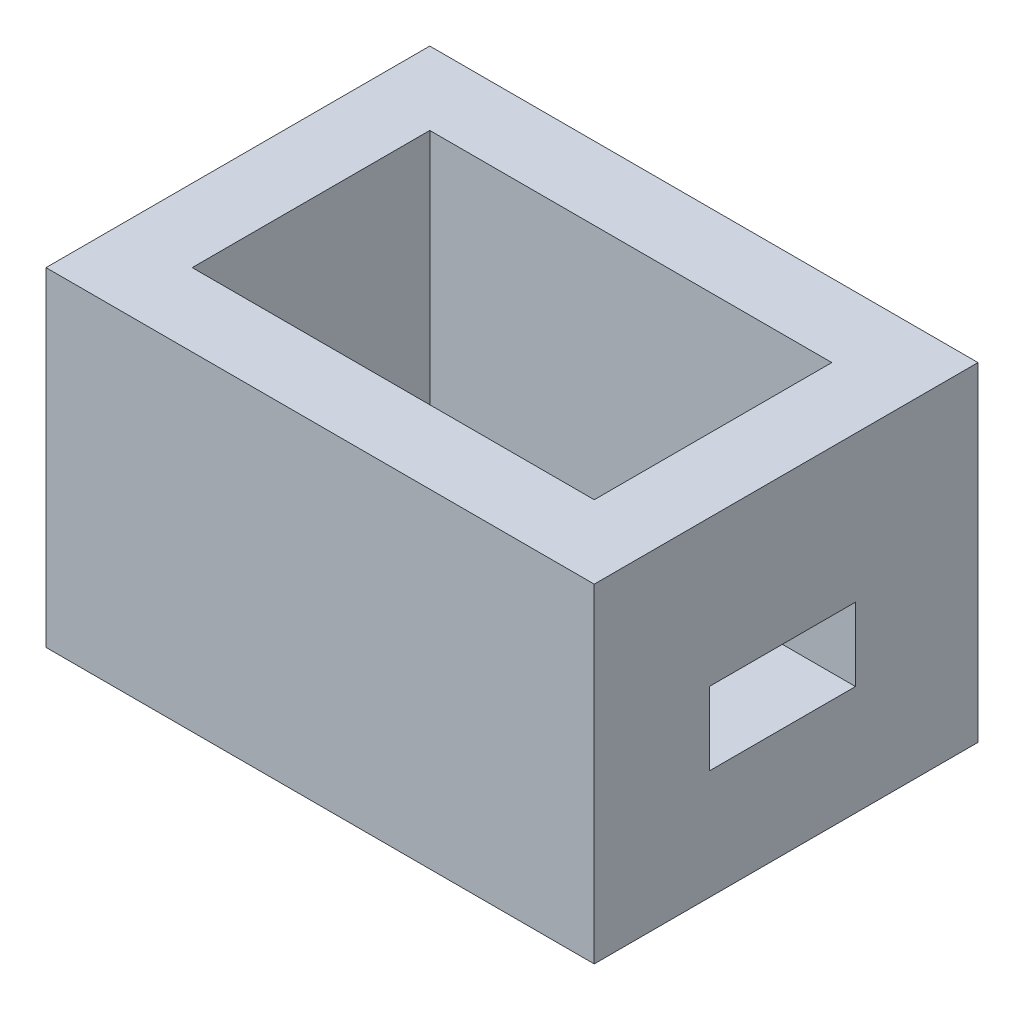
ISO-10303-21;
HEADER;
FILE_DESCRIPTION(('STEP AP214'),'2;1');
FILE_NAME('part.step','',(''),(''),'','','');
FILE_SCHEMA(('AUTOMOTIVE_DESIGN { 1 0 10303 214 1 1 1 1 }'));
ENDSEC;
DATA;
#1=APPLICATION_CONTEXT('core data for automotive mechanical design processes');
#2=APPLICATION_PROTOCOL_DEFINITION('international standard','automotive_design',2000,#1);
#3=PRODUCT_CONTEXT('',#1,'mechanical');
#4=PRODUCT('Part','Part','',(#3));
#5=PRODUCT_RELATED_PRODUCT_CATEGORY('part','',(#4));
#6=PRODUCT_DEFINITION_FORMATION('','',#4);
#7=PRODUCT_DEFINITION_CONTEXT('part definition',#1,'design');
#8=PRODUCT_DEFINITION('design','',#6,#7);
#9=PRODUCT_DEFINITION_SHAPE('','',#8);
#10=(LENGTH_UNIT() NAMED_UNIT(*) SI_UNIT(.MILLI.,.METRE.));
#11=(NAMED_UNIT(*) PLANE_ANGLE_UNIT() SI_UNIT($,.RADIAN.));
#12=(NAMED_UNIT(*) SI_UNIT($,.STERADIAN.) SOLID_ANGLE_UNIT());
#13=UNCERTAINTY_MEASURE_WITH_UNIT(LENGTH_MEASURE(1.E-05),#10,'distance_accuracy_value','');
#14=(GEOMETRIC_REPRESENTATION_CONTEXT(3) GLOBAL_UNCERTAINTY_ASSIGNED_CONTEXT((#13)) GLOBAL_UNIT_ASSIGNED_CONTEXT((#10,
#11,#12)) REPRESENTATION_CONTEXT('',''));
#15=CARTESIAN_POINT('',(0.,0.,0.));
#16=DIRECTION('',(0.,0.,1.));
#17=DIRECTION('',(1.,0.,0.));
#18=AXIS2_PLACEMENT_3D('',#15,#16,#17);
#19=CARTESIAN_POINT('',(15.,18.,10.5));
#20=DIRECTION('',(-1.,0.,0.));
#21=DIRECTION('',(0.,0.,1.));
#22=AXIS2_PLACEMENT_3D('',#19,#20,#21);
#23=PLANE('',#22);
#24=DIRECTION('',(0.,0.,-1.));
#25=VECTOR('',#24,1.);
#26=CARTESIAN_POINT('',(15.,0.,10.5));
#27=LINE('',#26,#25);
#28=CARTESIAN_POINT('',(15.,0.,10.5));
#29=VERTEX_POINT('',#28);
#30=CARTESIAN_POINT('',(15.,0.,-10.5));
#31=VERTEX_POINT('',#30);
#32=EDGE_CURVE('E231',#29,#31,#27,.T.);
#33=ORIENTED_EDGE('',*,*,#32,.T.);
#34=DIRECTION('',(0.,-1.,0.));
#35=VECTOR('',#34,1.);
#36=CARTESIAN_POINT('',(15.,18.,-10.5));
#37=LINE('',#36,#35);
#38=CARTESIAN_POINT('',(15.,18.,-10.5));
#39=VERTEX_POINT('',#38);
#40=EDGE_CURVE('E227',#39,#31,#37,.T.);
#41=ORIENTED_EDGE('',*,*,#40,.F.);
#42=DIRECTION('',(0.,0.,-1.));
#43=VECTOR('',#42,1.);
#44=CARTESIAN_POINT('',(15.,18.,10.5));
#45=LINE('',#44,#43);
#46=CARTESIAN_POINT('',(15.,18.,10.5));
#47=VERTEX_POINT('',#46);
#48=EDGE_CURVE('E216',#47,#39,#45,.T.);
#49=ORIENTED_EDGE('',*,*,#48,.F.);
#50=DIRECTION('',(0.,-1.,0.));
#51=VECTOR('',#50,1.);
#52=CARTESIAN_POINT('',(15.,18.,10.5));
#53=LINE('',#52,#51);
#54=EDGE_CURVE('E248',#47,#29,#53,.T.);
#55=ORIENTED_EDGE('',*,*,#54,.T.);
#56=EDGE_LOOP('',(#33,#41,#49,#55));
#57=FACE_BOUND('',#56,.T.);
#58=DIRECTION('',(0.,0.,-1.));
#59=VECTOR('',#58,1.);
#60=CARTESIAN_POINT('',(15.,10.,4.20539877717103));
#61=LINE('',#60,#59);
#62=CARTESIAN_POINT('',(15.,10.,4.20539877717103));
#63=VERTEX_POINT('',#62);
#64=CARTESIAN_POINT('',(15.,10.,-3.79460122282897));
#65=VERTEX_POINT('',#64);
#66=EDGE_CURVE('E61',#63,#65,#61,.T.);
#67=ORIENTED_EDGE('',*,*,#66,.T.);
#68=DIRECTION('',(0.,1.,0.));
#69=VECTOR('',#68,1.);
#70=CARTESIAN_POINT('',(15.,6.,-3.79460122282897));
#71=LINE('',#70,#69);
#72=CARTESIAN_POINT('',(15.,6.,-3.79460122282897));
#73=VERTEX_POINT('',#72);
#74=EDGE_CURVE('E144',#73,#65,#71,.T.);
#75=ORIENTED_EDGE('',*,*,#74,.F.);
#76=DIRECTION('',(0.,0.,-1.));
#77=VECTOR('',#76,1.);
#78=CARTESIAN_POINT('',(15.,6.,4.20539877717103));
#79=LINE('',#78,#77);
#80=CARTESIAN_POINT('',(15.,6.,4.20539877717103));
#81=VERTEX_POINT('',#80);
#82=EDGE_CURVE('E151',#81,#73,#79,.T.);
#83=ORIENTED_EDGE('',*,*,#82,.F.);
#84=DIRECTION('',(0.,1.,0.));
#85=VECTOR('',#84,1.);
#86=CARTESIAN_POINT('',(15.,6.,4.20539877717103));
#87=LINE('',#86,#85);
#88=EDGE_CURVE('E154',#81,#63,#87,.T.);
#89=ORIENTED_EDGE('',*,*,#88,.T.);
#90=EDGE_LOOP('',(#67,#75,#83,#89));
#91=FACE_BOUND('',#90,.T.);
#92=ADVANCED_FACE('F45',(#57,#91),#23,.F.);
#93=CARTESIAN_POINT('',(11.,18.,10.5));
#94=DIRECTION('',(-1.,0.,0.));
#95=DIRECTION('',(0.,0.,1.));
#96=AXIS2_PLACEMENT_3D('',#93,#94,#95);
#97=PLANE('',#96);
#98=DIRECTION('',(0.,0.,-1.));
#99=VECTOR('',#98,1.);
#100=CARTESIAN_POINT('',(11.,4.,10.5));
#101=LINE('',#100,#99);
#102=CARTESIAN_POINT('',(11.,4.,6.5));
#103=VERTEX_POINT('',#102);
#104=CARTESIAN_POINT('',(11.,4.,-6.5));
#105=VERTEX_POINT('',#104);
#106=EDGE_CURVE('E172',#103,#105,#101,.T.);
#107=ORIENTED_EDGE('',*,*,#106,.F.);
#108=DIRECTION('',(0.,-1.,0.));
#109=VECTOR('',#108,1.);
#110=CARTESIAN_POINT('',(11.,18.,6.5));
#111=LINE('',#110,#109);
#112=CARTESIAN_POINT('',(11.,18.,6.5));
#113=VERTEX_POINT('',#112);
#114=EDGE_CURVE('E181',#113,#103,#111,.T.);
#115=ORIENTED_EDGE('',*,*,#114,.F.);
#116=DIRECTION('',(0.,0.,-1.));
#117=VECTOR('',#116,1.);
#118=CARTESIAN_POINT('',(11.,18.,10.5));
#119=LINE('',#118,#117);
#120=CARTESIAN_POINT('',(11.,18.,-6.5));
#121=VERTEX_POINT('',#120);
#122=EDGE_CURVE('E202',#113,#121,#119,.T.);
#123=ORIENTED_EDGE('',*,*,#122,.T.);
#124=DIRECTION('',(0.,-1.,0.));
#125=VECTOR('',#124,1.);
#126=CARTESIAN_POINT('',(11.,18.,-6.5));
#127=LINE('',#126,#125);
#128=EDGE_CURVE('E178',#121,#105,#127,.T.);
#129=ORIENTED_EDGE('',*,*,#128,.T.);
#130=EDGE_LOOP('',(#107,#115,#123,#129));
#131=FACE_BOUND('',#130,.T.);
#132=DIRECTION('',(0.,-1.,0.));
#133=VECTOR('',#132,1.);
#134=CARTESIAN_POINT('',(11.,18.,-3.79460122282897));
#135=LINE('',#134,#133);
#136=CARTESIAN_POINT('',(11.,10.,-3.79460122282897));
#137=VERTEX_POINT('',#136);
#138=CARTESIAN_POINT('',(11.,6.,-3.79460122282897));
#139=VERTEX_POINT('',#138);
#140=EDGE_CURVE('E54',#137,#139,#135,.T.);
#141=ORIENTED_EDGE('',*,*,#140,.F.);
#142=DIRECTION('',(0.,0.,1.));
#143=VECTOR('',#142,1.);
#144=CARTESIAN_POINT('',(11.,10.,10.5));
#145=LINE('',#144,#143);
#146=CARTESIAN_POINT('',(11.,10.,4.20539877717103));
#147=VERTEX_POINT('',#146);
#148=EDGE_CURVE('E11',#137,#147,#145,.T.);
#149=ORIENTED_EDGE('',*,*,#148,.T.);
#150=DIRECTION('',(0.,-1.,0.));
#151=VECTOR('',#150,1.);
#152=CARTESIAN_POINT('',(11.,18.,4.20539877717103));
#153=LINE('',#152,#151);
#154=CARTESIAN_POINT('',(11.,6.,4.20539877717103));
#155=VERTEX_POINT('',#154);
#156=EDGE_CURVE('E244',#147,#155,#153,.T.);
#157=ORIENTED_EDGE('',*,*,#156,.T.);
#158=DIRECTION('',(0.,0.,1.));
#159=VECTOR('',#158,1.);
#160=CARTESIAN_POINT('',(11.,6.,10.5));
#161=LINE('',#160,#159);
#162=EDGE_CURVE('E257',#139,#155,#161,.T.);
#163=ORIENTED_EDGE('',*,*,#162,.F.);
#164=EDGE_LOOP('',(#141,#149,#157,#163));
#165=FACE_BOUND('',#164,.T.);
#166=ADVANCED_FACE('F264',(#131,#165),#97,.T.);
#167=CARTESIAN_POINT('',(0.,18.,0.));
#168=DIRECTION('',(0.,1.,0.));
#169=DIRECTION('',(0.,0.,1.));
#170=AXIS2_PLACEMENT_3D('',#167,#168,#169);
#171=PLANE('',#170);
#172=DIRECTION('',(1.,0.,0.));
#173=VECTOR('',#172,1.);
#174=CARTESIAN_POINT('',(-15.,18.,-10.5));
#175=LINE('',#174,#173);
#176=CARTESIAN_POINT('',(-15.,18.,-10.5));
#177=VERTEX_POINT('',#176);
#178=EDGE_CURVE('E212',#177,#39,#175,.T.);
#179=ORIENTED_EDGE('',*,*,#178,.F.);
#180=DIRECTION('',(0.,0.,-1.));
#181=VECTOR('',#180,1.);
#182=CARTESIAN_POINT('',(-15.,18.,10.5));
#183=LINE('',#182,#181);
#184=CARTESIAN_POINT('',(-15.,18.,10.5));
#185=VERTEX_POINT('',#184);
#186=EDGE_CURVE('E223',#185,#177,#183,.T.);
#187=ORIENTED_EDGE('',*,*,#186,.F.);
#188=DIRECTION('',(1.,0.,0.));
#189=VECTOR('',#188,1.);
#190=CARTESIAN_POINT('',(-15.,18.,10.5));
#191=LINE('',#190,#189);
#192=EDGE_CURVE('E220',#185,#47,#191,.T.);
#193=ORIENTED_EDGE('',*,*,#192,.T.);
#194=ORIENTED_EDGE('',*,*,#48,.T.);
#195=EDGE_LOOP('',(#179,#187,#193,#194));
#196=FACE_BOUND('',#195,.T.);
#197=DIRECTION('',(0.,0.,-1.));
#198=VECTOR('',#197,1.);
#199=CARTESIAN_POINT('',(-11.,18.,10.5));
#200=LINE('',#199,#198);
#201=CARTESIAN_POINT('',(-11.,18.,6.5));
#202=VERTEX_POINT('',#201);
#203=CARTESIAN_POINT('',(-11.,18.,-6.5));
#204=VERTEX_POINT('',#203);
#205=EDGE_CURVE('E182',#202,#204,#200,.T.);
#206=ORIENTED_EDGE('',*,*,#205,.T.);
#207=DIRECTION('',(1.,0.,0.));
#208=VECTOR('',#207,1.);
#209=CARTESIAN_POINT('',(-15.,18.,-6.5));
#210=LINE('',#209,#208);
#211=EDGE_CURVE('E187',#204,#121,#210,.T.);
#212=ORIENTED_EDGE('',*,*,#211,.T.);
#213=ORIENTED_EDGE('',*,*,#122,.F.);
#214=DIRECTION('',(1.,0.,0.));
#215=VECTOR('',#214,1.);
#216=CARTESIAN_POINT('',(-15.,18.,6.5));
#217=LINE('',#216,#215);
#218=EDGE_CURVE('E206',#202,#113,#217,.T.);
#219=ORIENTED_EDGE('',*,*,#218,.F.);
#220=EDGE_LOOP('',(#206,#212,#213,#219));
#221=FACE_BOUND('',#220,.T.);
#222=ADVANCED_FACE('F278',(#196,#221),#171,.T.);
#223=CARTESIAN_POINT('',(-15.,18.,-10.5));
#224=DIRECTION('',(0.,0.,-1.));
#225=DIRECTION('',(-1.,0.,0.));
#226=AXIS2_PLACEMENT_3D('',#223,#224,#225);
#227=PLANE('',#226);
#228=DIRECTION('',(1.,0.,0.));
#229=VECTOR('',#228,1.);
#230=CARTESIAN_POINT('',(-15.,0.,-10.5));
#231=LINE('',#230,#229);
#232=CARTESIAN_POINT('',(-15.,0.,-10.5));
#233=VERTEX_POINT('',#232);
#234=EDGE_CURVE('E176',#233,#31,#231,.T.);
#235=ORIENTED_EDGE('',*,*,#234,.F.);
#236=DIRECTION('',(0.,-1.,0.));
#237=VECTOR('',#236,1.);
#238=CARTESIAN_POINT('',(-15.,18.,-10.5));
#239=LINE('',#238,#237);
#240=EDGE_CURVE('E241',#177,#233,#239,.T.);
#241=ORIENTED_EDGE('',*,*,#240,.F.);
#242=ORIENTED_EDGE('',*,*,#178,.T.);
#243=ORIENTED_EDGE('',*,*,#40,.T.);
#244=EDGE_LOOP('',(#235,#241,#242,#243));
#245=FACE_BOUND('',#244,.T.);
#246=ADVANCED_FACE('F47',(#245),#227,.T.);
#247=CARTESIAN_POINT('',(-15.,18.,10.5));
#248=DIRECTION('',(-1.,0.,0.));
#249=DIRECTION('',(0.,0.,1.));
#250=AXIS2_PLACEMENT_3D('',#247,#248,#249);
#251=PLANE('',#250);
#252=DIRECTION('',(0.,0.,-1.));
#253=VECTOR('',#252,1.);
#254=CARTESIAN_POINT('',(-15.,0.,10.5));
#255=LINE('',#254,#253);
#256=CARTESIAN_POINT('',(-15.,0.,10.5));
#257=VERTEX_POINT('',#256);
#258=EDGE_CURVE('E217',#257,#233,#255,.T.);
#259=ORIENTED_EDGE('',*,*,#258,.F.);
#260=DIRECTION('',(0.,-1.,0.));
#261=VECTOR('',#260,1.);
#262=CARTESIAN_POINT('',(-15.,18.,10.5));
#263=LINE('',#262,#261);
#264=EDGE_CURVE('E245',#185,#257,#263,.T.);
#265=ORIENTED_EDGE('',*,*,#264,.F.);
#266=ORIENTED_EDGE('',*,*,#186,.T.);
#267=ORIENTED_EDGE('',*,*,#240,.T.);
#268=EDGE_LOOP('',(#259,#265,#266,#267));
#269=FACE_BOUND('',#268,.T.);
#270=ADVANCED_FACE('F286',(#269),#251,.T.);
#271=CARTESIAN_POINT('',(-15.,18.,10.5));
#272=DIRECTION('',(0.,0.,-1.));
#273=DIRECTION('',(-1.,0.,0.));
#274=AXIS2_PLACEMENT_3D('',#271,#272,#273);
#275=PLANE('',#274);
#276=DIRECTION('',(1.,0.,0.));
#277=VECTOR('',#276,1.);
#278=CARTESIAN_POINT('',(-15.,0.,10.5));
#279=LINE('',#278,#277);
#280=EDGE_CURVE('E235',#257,#29,#279,.T.);
#281=ORIENTED_EDGE('',*,*,#280,.T.);
#282=ORIENTED_EDGE('',*,*,#54,.F.);
#283=ORIENTED_EDGE('',*,*,#192,.F.);
#284=ORIENTED_EDGE('',*,*,#264,.T.);
#285=EDGE_LOOP('',(#281,#282,#283,#284));
#286=FACE_BOUND('',#285,.T.);
#287=ADVANCED_FACE('F282',(#286),#275,.F.);
#288=CARTESIAN_POINT('',(0.,0.,0.));
#289=DIRECTION('',(0.,1.,0.));
#290=DIRECTION('',(0.,0.,1.));
#291=AXIS2_PLACEMENT_3D('',#288,#289,#290);
#292=PLANE('',#291);
#293=ORIENTED_EDGE('',*,*,#234,.T.);
#294=ORIENTED_EDGE('',*,*,#32,.F.);
#295=ORIENTED_EDGE('',*,*,#280,.F.);
#296=ORIENTED_EDGE('',*,*,#258,.T.);
#297=EDGE_LOOP('',(#293,#294,#295,#296));
#298=FACE_BOUND('',#297,.T.);
#299=ADVANCED_FACE('F285',(#298),#292,.F.);
#300=CARTESIAN_POINT('',(-15.,18.,-6.5));
#301=DIRECTION('',(0.,0.,-1.));
#302=DIRECTION('',(-1.,0.,0.));
#303=AXIS2_PLACEMENT_3D('',#300,#301,#302);
#304=PLANE('',#303);
#305=DIRECTION('',(1.,0.,0.));
#306=VECTOR('',#305,1.);
#307=CARTESIAN_POINT('',(-15.,4.,-6.5));
#308=LINE('',#307,#306);
#309=CARTESIAN_POINT('',(-11.,4.,-6.5));
#310=VERTEX_POINT('',#309);
#311=EDGE_CURVE('E140',#310,#105,#308,.T.);
#312=ORIENTED_EDGE('',*,*,#311,.T.);
#313=ORIENTED_EDGE('',*,*,#128,.F.);
#314=ORIENTED_EDGE('',*,*,#211,.F.);
#315=DIRECTION('',(0.,-1.,0.));
#316=VECTOR('',#315,1.);
#317=CARTESIAN_POINT('',(-11.,18.,-6.5));
#318=LINE('',#317,#316);
#319=EDGE_CURVE('E173',#204,#310,#318,.T.);
#320=ORIENTED_EDGE('',*,*,#319,.T.);
#321=EDGE_LOOP('',(#312,#313,#314,#320));
#322=FACE_BOUND('',#321,.T.);
#323=ADVANCED_FACE('F293',(#322),#304,.F.);
#324=CARTESIAN_POINT('',(-11.,18.,10.5));
#325=DIRECTION('',(-1.,0.,0.));
#326=DIRECTION('',(0.,0.,1.));
#327=AXIS2_PLACEMENT_3D('',#324,#325,#326);
#328=PLANE('',#327);
#329=DIRECTION('',(0.,0.,-1.));
#330=VECTOR('',#329,1.);
#331=CARTESIAN_POINT('',(-11.,4.,10.5));
#332=LINE('',#331,#330);
#333=CARTESIAN_POINT('',(-11.,4.,6.5));
#334=VERTEX_POINT('',#333);
#335=EDGE_CURVE('E183',#334,#310,#332,.T.);
#336=ORIENTED_EDGE('',*,*,#335,.T.);
#337=ORIENTED_EDGE('',*,*,#319,.F.);
#338=ORIENTED_EDGE('',*,*,#205,.F.);
#339=DIRECTION('',(0.,-1.,0.));
#340=VECTOR('',#339,1.);
#341=CARTESIAN_POINT('',(-11.,18.,6.5));
#342=LINE('',#341,#340);
#343=EDGE_CURVE('E177',#202,#334,#342,.T.);
#344=ORIENTED_EDGE('',*,*,#343,.T.);
#345=EDGE_LOOP('',(#336,#337,#338,#344));
#346=FACE_BOUND('',#345,.T.);
#347=ADVANCED_FACE('F304',(#346),#328,.F.);
#348=CARTESIAN_POINT('',(-15.,18.,6.5));
#349=DIRECTION('',(0.,0.,-1.));
#350=DIRECTION('',(-1.,0.,0.));
#351=AXIS2_PLACEMENT_3D('',#348,#349,#350);
#352=PLANE('',#351);
#353=DIRECTION('',(1.,0.,0.));
#354=VECTOR('',#353,1.);
#355=CARTESIAN_POINT('',(-15.,4.,6.5));
#356=LINE('',#355,#354);
#357=EDGE_CURVE('E188',#334,#103,#356,.T.);
#358=ORIENTED_EDGE('',*,*,#357,.F.);
#359=ORIENTED_EDGE('',*,*,#343,.F.);
#360=ORIENTED_EDGE('',*,*,#218,.T.);
#361=ORIENTED_EDGE('',*,*,#114,.T.);
#362=EDGE_LOOP('',(#358,#359,#360,#361));
#363=FACE_BOUND('',#362,.T.);
#364=ADVANCED_FACE('F299',(#363),#352,.T.);
#365=CARTESIAN_POINT('',(0.,4.,0.));
#366=DIRECTION('',(0.,1.,0.));
#367=DIRECTION('',(0.,0.,1.));
#368=AXIS2_PLACEMENT_3D('',#365,#366,#367);
#369=PLANE('',#368);
#370=ORIENTED_EDGE('',*,*,#311,.F.);
#371=ORIENTED_EDGE('',*,*,#335,.F.);
#372=ORIENTED_EDGE('',*,*,#357,.T.);
#373=ORIENTED_EDGE('',*,*,#106,.T.);
#374=EDGE_LOOP('',(#370,#371,#372,#373));
#375=FACE_BOUND('',#374,.T.);
#376=ADVANCED_FACE('F298',(#375),#369,.T.);
#377=CARTESIAN_POINT('',(-6.4,10.,4.20539877717103));
#378=DIRECTION('',(0.,-1.,0.));
#379=DIRECTION('',(0.,0.,-1.));
#380=AXIS2_PLACEMENT_3D('',#377,#378,#379);
#381=PLANE('',#380);
#382=DIRECTION('',(1.,0.,0.));
#383=VECTOR('',#382,1.);
#384=CARTESIAN_POINT('',(-6.4,10.,-3.79460122282897));
#385=LINE('',#384,#383);
#386=EDGE_CURVE('E134',#137,#65,#385,.T.);
#387=ORIENTED_EDGE('',*,*,#386,.T.);
#388=ORIENTED_EDGE('',*,*,#66,.F.);
#389=DIRECTION('',(1.,0.,0.));
#390=VECTOR('',#389,1.);
#391=CARTESIAN_POINT('',(-6.4,10.,4.20539877717103));
#392=LINE('',#391,#390);
#393=EDGE_CURVE('E162',#147,#63,#392,.T.);
#394=ORIENTED_EDGE('',*,*,#393,.F.);
#395=ORIENTED_EDGE('',*,*,#148,.F.);
#396=EDGE_LOOP('',(#387,#388,#394,#395));
#397=FACE_BOUND('',#396,.T.);
#398=ADVANCED_FACE('F136',(#397),#381,.T.);
#399=CARTESIAN_POINT('',(-6.4,6.,-3.79460122282897));
#400=DIRECTION('',(0.,0.,-1.));
#401=DIRECTION('',(-1.,0.,0.));
#402=AXIS2_PLACEMENT_3D('',#399,#400,#401);
#403=PLANE('',#402);
#404=ORIENTED_EDGE('',*,*,#140,.T.);
#405=DIRECTION('',(1.,0.,0.));
#406=VECTOR('',#405,1.);
#407=CARTESIAN_POINT('',(-6.4,6.,-3.79460122282897));
#408=LINE('',#407,#406);
#409=EDGE_CURVE('E141',#139,#73,#408,.T.);
#410=ORIENTED_EDGE('',*,*,#409,.T.);
#411=ORIENTED_EDGE('',*,*,#74,.T.);
#412=ORIENTED_EDGE('',*,*,#386,.F.);
#413=EDGE_LOOP('',(#404,#410,#411,#412));
#414=FACE_BOUND('',#413,.T.);
#415=ADVANCED_FACE('F145',(#414),#403,.F.);
#416=CARTESIAN_POINT('',(-6.4,6.,4.20539877717103));
#417=DIRECTION('',(0.,-1.,0.));
#418=DIRECTION('',(0.,0.,-1.));
#419=AXIS2_PLACEMENT_3D('',#416,#417,#418);
#420=PLANE('',#419);
#421=ORIENTED_EDGE('',*,*,#162,.T.);
#422=DIRECTION('',(1.,0.,0.));
#423=VECTOR('',#422,1.);
#424=CARTESIAN_POINT('',(-6.4,6.,4.20539877717103));
#425=LINE('',#424,#423);
#426=EDGE_CURVE('E69',#155,#81,#425,.T.);
#427=ORIENTED_EDGE('',*,*,#426,.T.);
#428=ORIENTED_EDGE('',*,*,#82,.T.);
#429=ORIENTED_EDGE('',*,*,#409,.F.);
#430=EDGE_LOOP('',(#421,#427,#428,#429));
#431=FACE_BOUND('',#430,.T.);
#432=ADVANCED_FACE('F263',(#431),#420,.F.);
#433=CARTESIAN_POINT('',(-6.4,6.,4.20539877717103));
#434=DIRECTION('',(0.,0.,-1.));
#435=DIRECTION('',(-1.,0.,0.));
#436=AXIS2_PLACEMENT_3D('',#433,#434,#435);
#437=PLANE('',#436);
#438=ORIENTED_EDGE('',*,*,#393,.T.);
#439=ORIENTED_EDGE('',*,*,#88,.F.);
#440=ORIENTED_EDGE('',*,*,#426,.F.);
#441=ORIENTED_EDGE('',*,*,#156,.F.);
#442=EDGE_LOOP('',(#438,#439,#440,#441));
#443=FACE_BOUND('',#442,.T.);
#444=ADVANCED_FACE('F265',(#443),#437,.T.);
#445=CLOSED_SHELL('',(#92,#166,#222,#246,#270,#287,#299,#323,#347,#364,#376,#398,#415,#432,#444));
#446=MANIFOLD_SOLID_BREP('B2',#445);
#447=ADVANCED_BREP_SHAPE_REPRESENTATION('',(#18,#446),#14);
#448=SHAPE_DEFINITION_REPRESENTATION(#9,#447);
ENDSEC;
END-ISO-10303-21;
